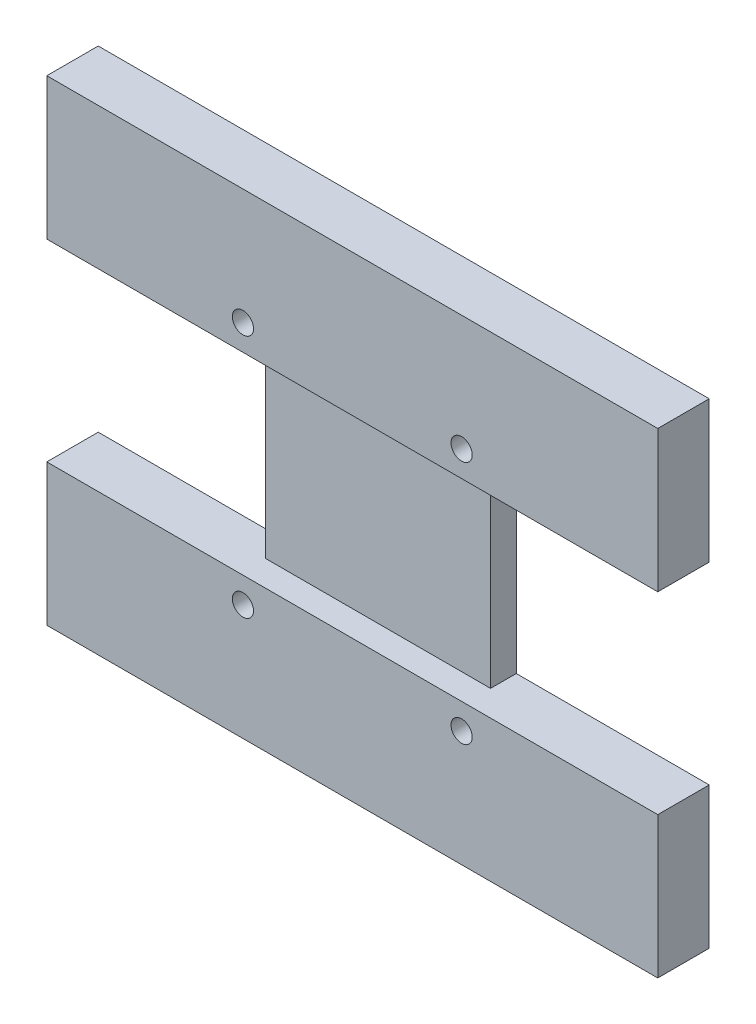
ISO-10303-21;
HEADER;
FILE_DESCRIPTION(('STEP AP214'),'2;1');
FILE_NAME('part.step','',(''),(''),'','','');
FILE_SCHEMA(('AUTOMOTIVE_DESIGN { 1 0 10303 214 1 1 1 1 }'));
ENDSEC;
DATA;
#1=APPLICATION_CONTEXT('core data for automotive mechanical design processes');
#2=APPLICATION_PROTOCOL_DEFINITION('international standard','automotive_design',2000,#1);
#3=PRODUCT_CONTEXT('',#1,'mechanical');
#4=PRODUCT('Part','Part','',(#3));
#5=PRODUCT_RELATED_PRODUCT_CATEGORY('part','',(#4));
#6=PRODUCT_DEFINITION_FORMATION('','',#4);
#7=PRODUCT_DEFINITION_CONTEXT('part definition',#1,'design');
#8=PRODUCT_DEFINITION('design','',#6,#7);
#9=PRODUCT_DEFINITION_SHAPE('','',#8);
#10=(LENGTH_UNIT() NAMED_UNIT(*) SI_UNIT(.MILLI.,.METRE.));
#11=(NAMED_UNIT(*) PLANE_ANGLE_UNIT() SI_UNIT($,.RADIAN.));
#12=(NAMED_UNIT(*) SI_UNIT($,.STERADIAN.) SOLID_ANGLE_UNIT());
#13=UNCERTAINTY_MEASURE_WITH_UNIT(LENGTH_MEASURE(1.E-05),#10,'distance_accuracy_value','');
#14=(GEOMETRIC_REPRESENTATION_CONTEXT(3) GLOBAL_UNCERTAINTY_ASSIGNED_CONTEXT((#13)) GLOBAL_UNIT_ASSIGNED_CONTEXT((#10,
#11,#12)) REPRESENTATION_CONTEXT('',''));
#15=CARTESIAN_POINT('',(0.,0.,0.));
#16=DIRECTION('',(0.,0.,1.));
#17=DIRECTION('',(1.,0.,0.));
#18=AXIS2_PLACEMENT_3D('',#15,#16,#17);
#19=CARTESIAN_POINT('',(17.5,15.,8.));
#20=DIRECTION('',(-1.,0.,0.));
#21=DIRECTION('',(0.,-1.,0.));
#22=AXIS2_PLACEMENT_3D('',#19,#20,#21);
#23=PLANE('',#22);
#24=DIRECTION('',(0.,1.,0.));
#25=VECTOR('',#24,1.);
#26=CARTESIAN_POINT('',(17.5,15.,4.));
#27=LINE('',#26,#25);
#28=CARTESIAN_POINT('',(17.5,-15.,4.));
#29=VERTEX_POINT('',#28);
#30=CARTESIAN_POINT('',(17.5,15.,4.));
#31=VERTEX_POINT('',#30);
#32=EDGE_CURVE('E222',#29,#31,#27,.T.);
#33=ORIENTED_EDGE('',*,*,#32,.F.);
#34=DIRECTION('',(0.,0.,-1.));
#35=VECTOR('',#34,1.);
#36=CARTESIAN_POINT('',(17.5,-15.,8.));
#37=LINE('',#36,#35);
#38=CARTESIAN_POINT('',(17.5,-15.,0.));
#39=VERTEX_POINT('',#38);
#40=EDGE_CURVE('E166',#29,#39,#37,.T.);
#41=ORIENTED_EDGE('',*,*,#40,.T.);
#42=DIRECTION('',(0.,1.,0.));
#43=VECTOR('',#42,1.);
#44=CARTESIAN_POINT('',(17.5,15.,0.));
#45=LINE('',#44,#43);
#46=CARTESIAN_POINT('',(17.5,15.,0.));
#47=VERTEX_POINT('',#46);
#48=EDGE_CURVE('E181',#39,#47,#45,.T.);
#49=ORIENTED_EDGE('',*,*,#48,.T.);
#50=DIRECTION('',(0.,0.,-1.));
#51=VECTOR('',#50,1.);
#52=CARTESIAN_POINT('',(17.5,15.,8.));
#53=LINE('',#52,#51);
#54=EDGE_CURVE('E164',#31,#47,#53,.T.);
#55=ORIENTED_EDGE('',*,*,#54,.F.);
#56=EDGE_LOOP('',(#33,#41,#49,#55));
#57=FACE_BOUND('',#56,.T.);
#58=ADVANCED_FACE('F37',(#57),#23,.F.);
#59=CARTESIAN_POINT('',(-17.5,15.,8.));
#60=DIRECTION('',(1.,0.,0.));
#61=DIRECTION('',(0.,1.,0.));
#62=AXIS2_PLACEMENT_3D('',#59,#60,#61);
#63=PLANE('',#62);
#64=DIRECTION('',(0.,-1.,0.));
#65=VECTOR('',#64,1.);
#66=CARTESIAN_POINT('',(-17.5,15.,4.));
#67=LINE('',#66,#65);
#68=CARTESIAN_POINT('',(-17.5,15.,4.));
#69=VERTEX_POINT('',#68);
#70=CARTESIAN_POINT('',(-17.5,-15.,4.));
#71=VERTEX_POINT('',#70);
#72=EDGE_CURVE('E234',#69,#71,#67,.T.);
#73=ORIENTED_EDGE('',*,*,#72,.F.);
#74=DIRECTION('',(0.,0.,-1.));
#75=VECTOR('',#74,1.);
#76=CARTESIAN_POINT('',(-17.5,15.,8.));
#77=LINE('',#76,#75);
#78=CARTESIAN_POINT('',(-17.5,15.,0.));
#79=VERTEX_POINT('',#78);
#80=EDGE_CURVE('E153',#69,#79,#77,.T.);
#81=ORIENTED_EDGE('',*,*,#80,.T.);
#82=DIRECTION('',(0.,-1.,0.));
#83=VECTOR('',#82,1.);
#84=CARTESIAN_POINT('',(-17.5,15.,0.));
#85=LINE('',#84,#83);
#86=CARTESIAN_POINT('',(-17.5,-15.,0.));
#87=VERTEX_POINT('',#86);
#88=EDGE_CURVE('E197',#79,#87,#85,.T.);
#89=ORIENTED_EDGE('',*,*,#88,.T.);
#90=DIRECTION('',(0.,0.,-1.));
#91=VECTOR('',#90,1.);
#92=CARTESIAN_POINT('',(-17.5,-15.,8.));
#93=LINE('',#92,#91);
#94=EDGE_CURVE('E157',#71,#87,#93,.T.);
#95=ORIENTED_EDGE('',*,*,#94,.F.);
#96=EDGE_LOOP('',(#73,#81,#89,#95));
#97=FACE_BOUND('',#96,.T.);
#98=ADVANCED_FACE('F215',(#97),#63,.F.);
#99=CARTESIAN_POINT('',(0.,0.,8.));
#100=DIRECTION('',(0.,0.,-1.));
#101=DIRECTION('',(-1.,0.,0.));
#102=AXIS2_PLACEMENT_3D('',#99,#100,#101);
#103=PLANE('',#102);
#104=CARTESIAN_POINT('',(-17.,19.,8.));
#105=DIRECTION('',(0.,0.,-1.));
#106=DIRECTION('',(-1.,0.,0.));
#107=AXIS2_PLACEMENT_3D('',#104,#105,#106);
#108=CIRCLE('',#107,1.65);
#109=CARTESIAN_POINT('',(-18.65,19.,8.));
#110=VERTEX_POINT('',#109);
#111=EDGE_CURVE('E254',#110,#110,#108,.T.);
#112=ORIENTED_EDGE('',*,*,#111,.T.);
#113=EDGE_LOOP('',(#112));
#114=FACE_BOUND('',#113,.T.);
#115=CARTESIAN_POINT('',(17.,19.,8.));
#116=DIRECTION('',(0.,0.,-1.));
#117=DIRECTION('',(-1.,0.,0.));
#118=AXIS2_PLACEMENT_3D('',#115,#116,#117);
#119=CIRCLE('',#118,1.65);
#120=CARTESIAN_POINT('',(15.35,19.,8.));
#121=VERTEX_POINT('',#120);
#122=EDGE_CURVE('E236',#121,#121,#119,.T.);
#123=ORIENTED_EDGE('',*,*,#122,.T.);
#124=EDGE_LOOP('',(#123));
#125=FACE_BOUND('',#124,.T.);
#126=DIRECTION('',(0.,-1.,0.));
#127=VECTOR('',#126,1.);
#128=CARTESIAN_POINT('',(-47.5,37.,8.));
#129=LINE('',#128,#127);
#130=CARTESIAN_POINT('',(-47.5,37.,8.));
#131=VERTEX_POINT('',#130);
#132=CARTESIAN_POINT('',(-47.5,15.,8.));
#133=VERTEX_POINT('',#132);
#134=EDGE_CURVE('E141',#131,#133,#129,.T.);
#135=ORIENTED_EDGE('',*,*,#134,.T.);
#136=DIRECTION('',(1.,0.,0.));
#137=VECTOR('',#136,1.);
#138=CARTESIAN_POINT('',(47.5,15.,8.));
#139=LINE('',#138,#137);
#140=CARTESIAN_POINT('',(47.5,15.,8.));
#141=VERTEX_POINT('',#140);
#142=EDGE_CURVE('E126',#133,#141,#139,.T.);
#143=ORIENTED_EDGE('',*,*,#142,.T.);
#144=DIRECTION('',(0.,1.,0.));
#145=VECTOR('',#144,1.);
#146=CARTESIAN_POINT('',(47.5,37.,8.));
#147=LINE('',#146,#145);
#148=CARTESIAN_POINT('',(47.5,37.,8.));
#149=VERTEX_POINT('',#148);
#150=EDGE_CURVE('E137',#141,#149,#147,.T.);
#151=ORIENTED_EDGE('',*,*,#150,.T.);
#152=DIRECTION('',(-1.,0.,0.));
#153=VECTOR('',#152,1.);
#154=CARTESIAN_POINT('',(47.5,37.,8.));
#155=LINE('',#154,#153);
#156=EDGE_CURVE('E144',#149,#131,#155,.T.);
#157=ORIENTED_EDGE('',*,*,#156,.T.);
#158=EDGE_LOOP('',(#135,#143,#151,#157));
#159=FACE_BOUND('',#158,.T.);
#160=ADVANCED_FACE('F142',(#114,#125,#159),#103,.F.);
#161=CARTESIAN_POINT('',(47.5,-37.,8.));
#162=DIRECTION('',(0.,1.,0.));
#163=DIRECTION('',(0.,0.,1.));
#164=AXIS2_PLACEMENT_3D('',#161,#162,#163);
#165=PLANE('',#164);
#166=DIRECTION('',(1.,0.,0.));
#167=VECTOR('',#166,1.);
#168=CARTESIAN_POINT('',(47.5,-37.,0.));
#169=LINE('',#168,#167);
#170=CARTESIAN_POINT('',(-47.5,-37.,0.));
#171=VERTEX_POINT('',#170);
#172=CARTESIAN_POINT('',(47.5,-37.,0.));
#173=VERTEX_POINT('',#172);
#174=EDGE_CURVE('E185',#171,#173,#169,.T.);
#175=ORIENTED_EDGE('',*,*,#174,.T.);
#176=DIRECTION('',(0.,0.,-1.));
#177=VECTOR('',#176,1.);
#178=CARTESIAN_POINT('',(47.5,-37.,8.));
#179=LINE('',#178,#177);
#180=CARTESIAN_POINT('',(47.5,-37.,8.));
#181=VERTEX_POINT('',#180);
#182=EDGE_CURVE('E11',#181,#173,#179,.T.);
#183=ORIENTED_EDGE('',*,*,#182,.F.);
#184=DIRECTION('',(1.,0.,0.));
#185=VECTOR('',#184,1.);
#186=CARTESIAN_POINT('',(47.5,-37.,8.));
#187=LINE('',#186,#185);
#188=CARTESIAN_POINT('',(-47.5,-37.,8.));
#189=VERTEX_POINT('',#188);
#190=EDGE_CURVE('E202',#189,#181,#187,.T.);
#191=ORIENTED_EDGE('',*,*,#190,.F.);
#192=DIRECTION('',(0.,0.,-1.));
#193=VECTOR('',#192,1.);
#194=CARTESIAN_POINT('',(-47.5,-37.,8.));
#195=LINE('',#194,#193);
#196=EDGE_CURVE('E203',#189,#171,#195,.T.);
#197=ORIENTED_EDGE('',*,*,#196,.T.);
#198=EDGE_LOOP('',(#175,#183,#191,#197));
#199=FACE_BOUND('',#198,.T.);
#200=ADVANCED_FACE('F39',(#199),#165,.F.);
#201=CARTESIAN_POINT('',(47.5,-37.,8.));
#202=DIRECTION('',(-1.,0.,0.));
#203=DIRECTION('',(0.,0.,1.));
#204=AXIS2_PLACEMENT_3D('',#201,#202,#203);
#205=PLANE('',#204);
#206=DIRECTION('',(0.,1.,0.));
#207=VECTOR('',#206,1.);
#208=CARTESIAN_POINT('',(47.5,-37.,0.));
#209=LINE('',#208,#207);
#210=CARTESIAN_POINT('',(47.5,-15.,0.));
#211=VERTEX_POINT('',#210);
#212=EDGE_CURVE('E178',#173,#211,#209,.T.);
#213=ORIENTED_EDGE('',*,*,#212,.T.);
#214=DIRECTION('',(0.,0.,-1.));
#215=VECTOR('',#214,1.);
#216=CARTESIAN_POINT('',(47.5,-15.,8.));
#217=LINE('',#216,#215);
#218=CARTESIAN_POINT('',(47.5,-15.,8.));
#219=VERTEX_POINT('',#218);
#220=EDGE_CURVE('E46',#219,#211,#217,.T.);
#221=ORIENTED_EDGE('',*,*,#220,.F.);
#222=DIRECTION('',(0.,1.,0.));
#223=VECTOR('',#222,1.);
#224=CARTESIAN_POINT('',(47.5,-37.,8.));
#225=LINE('',#224,#223);
#226=EDGE_CURVE('E109',#181,#219,#225,.T.);
#227=ORIENTED_EDGE('',*,*,#226,.F.);
#228=ORIENTED_EDGE('',*,*,#182,.T.);
#229=EDGE_LOOP('',(#213,#221,#227,#228));
#230=FACE_BOUND('',#229,.T.);
#231=ADVANCED_FACE('F313',(#230),#205,.F.);
#232=CARTESIAN_POINT('',(47.5,37.,8.));
#233=DIRECTION('',(-1.,0.,0.));
#234=DIRECTION('',(0.,0.,1.));
#235=AXIS2_PLACEMENT_3D('',#232,#233,#234);
#236=PLANE('',#235);
#237=DIRECTION('',(0.,1.,0.));
#238=VECTOR('',#237,1.);
#239=CARTESIAN_POINT('',(47.5,37.,0.));
#240=LINE('',#239,#238);
#241=CARTESIAN_POINT('',(47.5,15.,0.));
#242=VERTEX_POINT('',#241);
#243=CARTESIAN_POINT('',(47.5,37.,0.));
#244=VERTEX_POINT('',#243);
#245=EDGE_CURVE('E190',#242,#244,#240,.T.);
#246=ORIENTED_EDGE('',*,*,#245,.T.);
#247=DIRECTION('',(0.,0.,-1.));
#248=VECTOR('',#247,1.);
#249=CARTESIAN_POINT('',(47.5,37.,8.));
#250=LINE('',#249,#248);
#251=EDGE_CURVE('E155',#149,#244,#250,.T.);
#252=ORIENTED_EDGE('',*,*,#251,.F.);
#253=ORIENTED_EDGE('',*,*,#150,.F.);
#254=DIRECTION('',(0.,0.,-1.));
#255=VECTOR('',#254,1.);
#256=CARTESIAN_POINT('',(47.5,15.,8.));
#257=LINE('',#256,#255);
#258=EDGE_CURVE('E134',#141,#242,#257,.T.);
#259=ORIENTED_EDGE('',*,*,#258,.T.);
#260=EDGE_LOOP('',(#246,#252,#253,#259));
#261=FACE_BOUND('',#260,.T.);
#262=ADVANCED_FACE('F311',(#261),#236,.F.);
#263=CARTESIAN_POINT('',(47.5,37.,8.));
#264=DIRECTION('',(0.,-1.,0.));
#265=DIRECTION('',(0.,0.,-1.));
#266=AXIS2_PLACEMENT_3D('',#263,#264,#265);
#267=PLANE('',#266);
#268=DIRECTION('',(-1.,0.,0.));
#269=VECTOR('',#268,1.);
#270=CARTESIAN_POINT('',(47.5,37.,0.));
#271=LINE('',#270,#269);
#272=CARTESIAN_POINT('',(-47.5,37.,0.));
#273=VERTEX_POINT('',#272);
#274=EDGE_CURVE('E192',#244,#273,#271,.T.);
#275=ORIENTED_EDGE('',*,*,#274,.T.);
#276=DIRECTION('',(0.,0.,-1.));
#277=VECTOR('',#276,1.);
#278=CARTESIAN_POINT('',(-47.5,37.,8.));
#279=LINE('',#278,#277);
#280=EDGE_CURVE('E152',#131,#273,#279,.T.);
#281=ORIENTED_EDGE('',*,*,#280,.F.);
#282=ORIENTED_EDGE('',*,*,#156,.F.);
#283=ORIENTED_EDGE('',*,*,#251,.T.);
#284=EDGE_LOOP('',(#275,#281,#282,#283));
#285=FACE_BOUND('',#284,.T.);
#286=ADVANCED_FACE('F319',(#285),#267,.F.);
#287=CARTESIAN_POINT('',(-47.5,37.,8.));
#288=DIRECTION('',(1.,0.,0.));
#289=DIRECTION('',(0.,0.,-1.));
#290=AXIS2_PLACEMENT_3D('',#287,#288,#289);
#291=PLANE('',#290);
#292=DIRECTION('',(0.,-1.,0.));
#293=VECTOR('',#292,1.);
#294=CARTESIAN_POINT('',(-47.5,37.,0.));
#295=LINE('',#294,#293);
#296=CARTESIAN_POINT('',(-47.5,15.,0.));
#297=VERTEX_POINT('',#296);
#298=EDGE_CURVE('E151',#273,#297,#295,.T.);
#299=ORIENTED_EDGE('',*,*,#298,.T.);
#300=DIRECTION('',(0.,0.,-1.));
#301=VECTOR('',#300,1.);
#302=CARTESIAN_POINT('',(-47.5,15.,8.));
#303=LINE('',#302,#301);
#304=EDGE_CURVE('E131',#133,#297,#303,.T.);
#305=ORIENTED_EDGE('',*,*,#304,.F.);
#306=ORIENTED_EDGE('',*,*,#134,.F.);
#307=ORIENTED_EDGE('',*,*,#280,.T.);
#308=EDGE_LOOP('',(#299,#305,#306,#307));
#309=FACE_BOUND('',#308,.T.);
#310=ADVANCED_FACE('F149',(#309),#291,.F.);
#311=CARTESIAN_POINT('',(-47.5,15.,8.));
#312=DIRECTION('',(0.,1.,0.));
#313=DIRECTION('',(-1.,0.,0.));
#314=AXIS2_PLACEMENT_3D('',#311,#312,#313);
#315=PLANE('',#314);
#316=DIRECTION('',(1.,0.,0.));
#317=VECTOR('',#316,1.);
#318=CARTESIAN_POINT('',(-47.5,15.,0.));
#319=LINE('',#318,#317);
#320=EDGE_CURVE('E195',#297,#79,#319,.T.);
#321=ORIENTED_EDGE('',*,*,#320,.T.);
#322=ORIENTED_EDGE('',*,*,#80,.F.);
#323=DIRECTION('',(-1.,0.,0.));
#324=VECTOR('',#323,1.);
#325=CARTESIAN_POINT('',(-17.5,15.,4.));
#326=LINE('',#325,#324);
#327=EDGE_CURVE('E220',#31,#69,#326,.T.);
#328=ORIENTED_EDGE('',*,*,#327,.F.);
#329=ORIENTED_EDGE('',*,*,#54,.T.);
#330=DIRECTION('',(1.,0.,0.));
#331=VECTOR('',#330,1.);
#332=CARTESIAN_POINT('',(47.5,15.,0.));
#333=LINE('',#332,#331);
#334=EDGE_CURVE('E183',#47,#242,#333,.T.);
#335=ORIENTED_EDGE('',*,*,#334,.T.);
#336=ORIENTED_EDGE('',*,*,#258,.F.);
#337=ORIENTED_EDGE('',*,*,#142,.F.);
#338=ORIENTED_EDGE('',*,*,#304,.T.);
#339=EDGE_LOOP('',(#321,#322,#328,#329,#335,#336,#337,#338));
#340=FACE_BOUND('',#339,.T.);
#341=ADVANCED_FACE('F129',(#340),#315,.F.);
#342=CARTESIAN_POINT('',(-47.5,-15.,8.));
#343=DIRECTION('',(0.,-1.,0.));
#344=DIRECTION('',(1.,0.,0.));
#345=AXIS2_PLACEMENT_3D('',#342,#343,#344);
#346=PLANE('',#345);
#347=DIRECTION('',(-1.,0.,0.));
#348=VECTOR('',#347,1.);
#349=CARTESIAN_POINT('',(-47.5,-15.,0.));
#350=LINE('',#349,#348);
#351=CARTESIAN_POINT('',(-47.5,-15.,0.));
#352=VERTEX_POINT('',#351);
#353=EDGE_CURVE('E95',#87,#352,#350,.T.);
#354=ORIENTED_EDGE('',*,*,#353,.T.);
#355=DIRECTION('',(0.,0.,-1.));
#356=VECTOR('',#355,1.);
#357=CARTESIAN_POINT('',(-47.5,-15.,8.));
#358=LINE('',#357,#356);
#359=CARTESIAN_POINT('',(-47.5,-15.,8.));
#360=VERTEX_POINT('',#359);
#361=EDGE_CURVE('E205',#360,#352,#358,.T.);
#362=ORIENTED_EDGE('',*,*,#361,.F.);
#363=DIRECTION('',(-1.,0.,0.));
#364=VECTOR('',#363,1.);
#365=CARTESIAN_POINT('',(47.5,-15.,8.));
#366=LINE('',#365,#364);
#367=EDGE_CURVE('E138',#219,#360,#366,.T.);
#368=ORIENTED_EDGE('',*,*,#367,.F.);
#369=ORIENTED_EDGE('',*,*,#220,.T.);
#370=DIRECTION('',(-1.,0.,0.));
#371=VECTOR('',#370,1.);
#372=CARTESIAN_POINT('',(47.5,-15.,0.));
#373=LINE('',#372,#371);
#374=EDGE_CURVE('E173',#211,#39,#373,.T.);
#375=ORIENTED_EDGE('',*,*,#374,.T.);
#376=ORIENTED_EDGE('',*,*,#40,.F.);
#377=DIRECTION('',(1.,0.,0.));
#378=VECTOR('',#377,1.);
#379=CARTESIAN_POINT('',(-17.5,-15.,4.));
#380=LINE('',#379,#378);
#381=EDGE_CURVE('E210',#71,#29,#380,.T.);
#382=ORIENTED_EDGE('',*,*,#381,.F.);
#383=ORIENTED_EDGE('',*,*,#94,.T.);
#384=EDGE_LOOP('',(#354,#362,#368,#369,#375,#376,#382,#383));
#385=FACE_BOUND('',#384,.T.);
#386=ADVANCED_FACE('F171',(#385),#346,.F.);
#387=CARTESIAN_POINT('',(-47.5,-37.,8.));
#388=DIRECTION('',(1.,0.,0.));
#389=DIRECTION('',(0.,0.,-1.));
#390=AXIS2_PLACEMENT_3D('',#387,#388,#389);
#391=PLANE('',#390);
#392=DIRECTION('',(0.,-1.,0.));
#393=VECTOR('',#392,1.);
#394=CARTESIAN_POINT('',(-47.5,-37.,0.));
#395=LINE('',#394,#393);
#396=EDGE_CURVE('E101',#352,#171,#395,.T.);
#397=ORIENTED_EDGE('',*,*,#396,.T.);
#398=ORIENTED_EDGE('',*,*,#196,.F.);
#399=DIRECTION('',(0.,-1.,0.));
#400=VECTOR('',#399,1.);
#401=CARTESIAN_POINT('',(-47.5,-37.,8.));
#402=LINE('',#401,#400);
#403=EDGE_CURVE('E54',#360,#189,#402,.T.);
#404=ORIENTED_EDGE('',*,*,#403,.F.);
#405=ORIENTED_EDGE('',*,*,#361,.T.);
#406=EDGE_LOOP('',(#397,#398,#404,#405));
#407=FACE_BOUND('',#406,.T.);
#408=ADVANCED_FACE('F322',(#407),#391,.F.);
#409=CARTESIAN_POINT('',(-17.,-19.,8.));
#410=DIRECTION('',(0.,0.,-1.));
#411=DIRECTION('',(-1.,0.,0.));
#412=AXIS2_PLACEMENT_3D('',#409,#410,#411);
#413=CIRCLE('',#412,1.65);
#414=CARTESIAN_POINT('',(-18.65,-19.,8.));
#415=VERTEX_POINT('',#414);
#416=EDGE_CURVE('E263',#415,#415,#413,.T.);
#417=ORIENTED_EDGE('',*,*,#416,.T.);
#418=EDGE_LOOP('',(#417));
#419=FACE_BOUND('',#418,.T.);
#420=CARTESIAN_POINT('',(17.,-19.,8.));
#421=DIRECTION('',(0.,0.,-1.));
#422=DIRECTION('',(-1.,0.,0.));
#423=AXIS2_PLACEMENT_3D('',#420,#421,#422);
#424=CIRCLE('',#423,1.65);
#425=CARTESIAN_POINT('',(15.35,-19.,8.));
#426=VERTEX_POINT('',#425);
#427=EDGE_CURVE('E245',#426,#426,#424,.T.);
#428=ORIENTED_EDGE('',*,*,#427,.T.);
#429=EDGE_LOOP('',(#428));
#430=FACE_BOUND('',#429,.T.);
#431=ORIENTED_EDGE('',*,*,#367,.T.);
#432=ORIENTED_EDGE('',*,*,#403,.T.);
#433=ORIENTED_EDGE('',*,*,#190,.T.);
#434=ORIENTED_EDGE('',*,*,#226,.T.);
#435=EDGE_LOOP('',(#431,#432,#433,#434));
#436=FACE_BOUND('',#435,.T.);
#437=ADVANCED_FACE('F278',(#419,#430,#436),#103,.F.);
#438=CARTESIAN_POINT('',(0.,0.,0.));
#439=DIRECTION('',(0.,0.,-1.));
#440=DIRECTION('',(-1.,0.,0.));
#441=AXIS2_PLACEMENT_3D('',#438,#439,#440);
#442=PLANE('',#441);
#443=CARTESIAN_POINT('',(-17.,-19.,0.));
#444=DIRECTION('',(0.,0.,-1.));
#445=DIRECTION('',(-1.,0.,0.));
#446=AXIS2_PLACEMENT_3D('',#443,#444,#445);
#447=CIRCLE('',#446,2.025);
#448=CARTESIAN_POINT('',(-19.025,-19.,0.));
#449=VERTEX_POINT('',#448);
#450=EDGE_CURVE('E269',#449,#449,#447,.T.);
#451=ORIENTED_EDGE('',*,*,#450,.F.);
#452=EDGE_LOOP('',(#451));
#453=FACE_BOUND('',#452,.T.);
#454=CARTESIAN_POINT('',(-17.,19.,0.));
#455=DIRECTION('',(0.,0.,-1.));
#456=DIRECTION('',(-1.,0.,0.));
#457=AXIS2_PLACEMENT_3D('',#454,#455,#456);
#458=CIRCLE('',#457,2.025);
#459=CARTESIAN_POINT('',(-19.025,19.,0.));
#460=VERTEX_POINT('',#459);
#461=EDGE_CURVE('E260',#460,#460,#458,.T.);
#462=ORIENTED_EDGE('',*,*,#461,.F.);
#463=EDGE_LOOP('',(#462));
#464=FACE_BOUND('',#463,.T.);
#465=CARTESIAN_POINT('',(17.,-19.,0.));
#466=DIRECTION('',(0.,0.,-1.));
#467=DIRECTION('',(-1.,0.,0.));
#468=AXIS2_PLACEMENT_3D('',#465,#466,#467);
#469=CIRCLE('',#468,2.025);
#470=CARTESIAN_POINT('',(14.975,-19.,0.));
#471=VERTEX_POINT('',#470);
#472=EDGE_CURVE('E251',#471,#471,#469,.T.);
#473=ORIENTED_EDGE('',*,*,#472,.F.);
#474=EDGE_LOOP('',(#473));
#475=FACE_BOUND('',#474,.T.);
#476=CARTESIAN_POINT('',(17.,19.,0.));
#477=DIRECTION('',(0.,0.,-1.));
#478=DIRECTION('',(-1.,0.,0.));
#479=AXIS2_PLACEMENT_3D('',#476,#477,#478);
#480=CIRCLE('',#479,2.025);
#481=CARTESIAN_POINT('',(14.975,19.,0.));
#482=VERTEX_POINT('',#481);
#483=EDGE_CURVE('E242',#482,#482,#480,.T.);
#484=ORIENTED_EDGE('',*,*,#483,.F.);
#485=EDGE_LOOP('',(#484));
#486=FACE_BOUND('',#485,.T.);
#487=ORIENTED_EDGE('',*,*,#174,.F.);
#488=ORIENTED_EDGE('',*,*,#396,.F.);
#489=ORIENTED_EDGE('',*,*,#353,.F.);
#490=ORIENTED_EDGE('',*,*,#88,.F.);
#491=ORIENTED_EDGE('',*,*,#320,.F.);
#492=ORIENTED_EDGE('',*,*,#298,.F.);
#493=ORIENTED_EDGE('',*,*,#274,.F.);
#494=ORIENTED_EDGE('',*,*,#245,.F.);
#495=ORIENTED_EDGE('',*,*,#334,.F.);
#496=ORIENTED_EDGE('',*,*,#48,.F.);
#497=ORIENTED_EDGE('',*,*,#374,.F.);
#498=ORIENTED_EDGE('',*,*,#212,.F.);
#499=EDGE_LOOP('',(#487,#488,#489,#490,#491,#492,#493,#494,#495,#496,#497,#498));
#500=FACE_BOUND('',#499,.T.);
#501=ADVANCED_FACE('F177',(#453,#464,#475,#486,#500),#442,.T.);
#502=CARTESIAN_POINT('',(0.,0.,4.));
#503=DIRECTION('',(0.,0.,1.));
#504=DIRECTION('',(1.,0.,0.));
#505=AXIS2_PLACEMENT_3D('',#502,#503,#504);
#506=PLANE('',#505);
#507=ORIENTED_EDGE('',*,*,#72,.T.);
#508=ORIENTED_EDGE('',*,*,#381,.T.);
#509=ORIENTED_EDGE('',*,*,#32,.T.);
#510=ORIENTED_EDGE('',*,*,#327,.T.);
#511=EDGE_LOOP('',(#507,#508,#509,#510));
#512=FACE_BOUND('',#511,.T.);
#513=ADVANCED_FACE('F277',(#512),#506,.T.);
#514=CARTESIAN_POINT('',(17.,19.,0.));
#515=DIRECTION('',(0.,0.,-1.));
#516=DIRECTION('',(-1.,0.,0.));
#517=AXIS2_PLACEMENT_3D('',#514,#515,#516);
#518=CYLINDRICAL_SURFACE('',#517,1.65);
#519=ORIENTED_EDGE('',*,*,#122,.F.);
#520=EDGE_LOOP('',(#519));
#521=FACE_BOUND('',#520,.T.);
#522=CARTESIAN_POINT('',(17.,19.,0.375000000000001));
#523=DIRECTION('',(0.,0.,-1.));
#524=DIRECTION('',(-1.,0.,0.));
#525=AXIS2_PLACEMENT_3D('',#522,#523,#524);
#526=CIRCLE('',#525,1.65);
#527=CARTESIAN_POINT('',(15.35,19.,0.375000000000001));
#528=VERTEX_POINT('',#527);
#529=EDGE_CURVE('E239',#528,#528,#526,.T.);
#530=ORIENTED_EDGE('',*,*,#529,.T.);
#531=EDGE_LOOP('',(#530));
#532=FACE_BOUND('',#531,.T.);
#533=ADVANCED_FACE('F289',(#521,#532),#518,.F.);
#534=CARTESIAN_POINT('',(17.,19.,0.));
#535=DIRECTION('',(0.,0.,-1.));
#536=DIRECTION('',(-1.,0.,0.));
#537=AXIS2_PLACEMENT_3D('',#534,#535,#536);
#538=CONICAL_SURFACE('',#537,2.025,0.785398163397447);
#539=ORIENTED_EDGE('',*,*,#529,.F.);
#540=EDGE_LOOP('',(#539));
#541=FACE_BOUND('',#540,.T.);
#542=ORIENTED_EDGE('',*,*,#483,.T.);
#543=EDGE_LOOP('',(#542));
#544=FACE_BOUND('',#543,.T.);
#545=ADVANCED_FACE('F286',(#541,#544),#538,.F.);
#546=CARTESIAN_POINT('',(17.,-19.,0.));
#547=DIRECTION('',(0.,0.,-1.));
#548=DIRECTION('',(-1.,0.,0.));
#549=AXIS2_PLACEMENT_3D('',#546,#547,#548);
#550=CYLINDRICAL_SURFACE('',#549,1.65);
#551=ORIENTED_EDGE('',*,*,#427,.F.);
#552=EDGE_LOOP('',(#551));
#553=FACE_BOUND('',#552,.T.);
#554=CARTESIAN_POINT('',(17.,-19.,0.375000000000001));
#555=DIRECTION('',(0.,0.,-1.));
#556=DIRECTION('',(-1.,0.,0.));
#557=AXIS2_PLACEMENT_3D('',#554,#555,#556);
#558=CIRCLE('',#557,1.65);
#559=CARTESIAN_POINT('',(15.35,-19.,0.375000000000001));
#560=VERTEX_POINT('',#559);
#561=EDGE_CURVE('E248',#560,#560,#558,.T.);
#562=ORIENTED_EDGE('',*,*,#561,.T.);
#563=EDGE_LOOP('',(#562));
#564=FACE_BOUND('',#563,.T.);
#565=ADVANCED_FACE('F288',(#553,#564),#550,.F.);
#566=CARTESIAN_POINT('',(17.,-19.,0.));
#567=DIRECTION('',(0.,0.,-1.));
#568=DIRECTION('',(-1.,0.,0.));
#569=AXIS2_PLACEMENT_3D('',#566,#567,#568);
#570=CONICAL_SURFACE('',#569,2.025,0.785398163397447);
#571=ORIENTED_EDGE('',*,*,#561,.F.);
#572=EDGE_LOOP('',(#571));
#573=FACE_BOUND('',#572,.T.);
#574=ORIENTED_EDGE('',*,*,#472,.T.);
#575=EDGE_LOOP('',(#574));
#576=FACE_BOUND('',#575,.T.);
#577=ADVANCED_FACE('F296',(#573,#576),#570,.F.);
#578=CARTESIAN_POINT('',(-17.,19.,0.));
#579=DIRECTION('',(0.,0.,-1.));
#580=DIRECTION('',(-1.,0.,0.));
#581=AXIS2_PLACEMENT_3D('',#578,#579,#580);
#582=CYLINDRICAL_SURFACE('',#581,1.65);
#583=ORIENTED_EDGE('',*,*,#111,.F.);
#584=EDGE_LOOP('',(#583));
#585=FACE_BOUND('',#584,.T.);
#586=CARTESIAN_POINT('',(-17.,19.,0.375000000000001));
#587=DIRECTION('',(0.,0.,-1.));
#588=DIRECTION('',(-1.,0.,0.));
#589=AXIS2_PLACEMENT_3D('',#586,#587,#588);
#590=CIRCLE('',#589,1.65);
#591=CARTESIAN_POINT('',(-18.65,19.,0.375000000000001));
#592=VERTEX_POINT('',#591);
#593=EDGE_CURVE('E257',#592,#592,#590,.T.);
#594=ORIENTED_EDGE('',*,*,#593,.T.);
#595=EDGE_LOOP('',(#594));
#596=FACE_BOUND('',#595,.T.);
#597=ADVANCED_FACE('F389',(#585,#596),#582,.F.);
#598=CARTESIAN_POINT('',(-17.,19.,0.));
#599=DIRECTION('',(0.,0.,-1.));
#600=DIRECTION('',(-1.,0.,0.));
#601=AXIS2_PLACEMENT_3D('',#598,#599,#600);
#602=CONICAL_SURFACE('',#601,2.025,0.785398163397447);
#603=ORIENTED_EDGE('',*,*,#593,.F.);
#604=EDGE_LOOP('',(#603));
#605=FACE_BOUND('',#604,.T.);
#606=ORIENTED_EDGE('',*,*,#461,.T.);
#607=EDGE_LOOP('',(#606));
#608=FACE_BOUND('',#607,.T.);
#609=ADVANCED_FACE('F379',(#605,#608),#602,.F.);
#610=CARTESIAN_POINT('',(-17.,-19.,0.));
#611=DIRECTION('',(0.,0.,-1.));
#612=DIRECTION('',(-1.,0.,0.));
#613=AXIS2_PLACEMENT_3D('',#610,#611,#612);
#614=CYLINDRICAL_SURFACE('',#613,1.65);
#615=ORIENTED_EDGE('',*,*,#416,.F.);
#616=EDGE_LOOP('',(#615));
#617=FACE_BOUND('',#616,.T.);
#618=CARTESIAN_POINT('',(-17.,-19.,0.375000000000001));
#619=DIRECTION('',(0.,0.,-1.));
#620=DIRECTION('',(-1.,0.,0.));
#621=AXIS2_PLACEMENT_3D('',#618,#619,#620);
#622=CIRCLE('',#621,1.65);
#623=CARTESIAN_POINT('',(-18.65,-19.,0.375000000000001));
#624=VERTEX_POINT('',#623);
#625=EDGE_CURVE('E266',#624,#624,#622,.T.);
#626=ORIENTED_EDGE('',*,*,#625,.T.);
#627=EDGE_LOOP('',(#626));
#628=FACE_BOUND('',#627,.T.);
#629=ADVANCED_FACE('F374',(#617,#628),#614,.F.);
#630=CARTESIAN_POINT('',(-17.,-19.,0.));
#631=DIRECTION('',(0.,0.,-1.));
#632=DIRECTION('',(-1.,0.,0.));
#633=AXIS2_PLACEMENT_3D('',#630,#631,#632);
#634=CONICAL_SURFACE('',#633,2.025,0.785398163397447);
#635=ORIENTED_EDGE('',*,*,#625,.F.);
#636=EDGE_LOOP('',(#635));
#637=FACE_BOUND('',#636,.T.);
#638=ORIENTED_EDGE('',*,*,#450,.T.);
#639=EDGE_LOOP('',(#638));
#640=FACE_BOUND('',#639,.T.);
#641=ADVANCED_FACE('F273',(#637,#640),#634,.F.);
#642=CLOSED_SHELL('',(#58,#98,#160,#200,#231,#262,#286,#310,#341,#386,#408,#437,#501,#513,#533,
#545,#565,#577,#597,#609,#629,#641));
#643=MANIFOLD_SOLID_BREP('B2',#642);
#644=ADVANCED_BREP_SHAPE_REPRESENTATION('',(#18,#643),#14);
#645=SHAPE_DEFINITION_REPRESENTATION(#9,#644);
ENDSEC;
END-ISO-10303-21;
